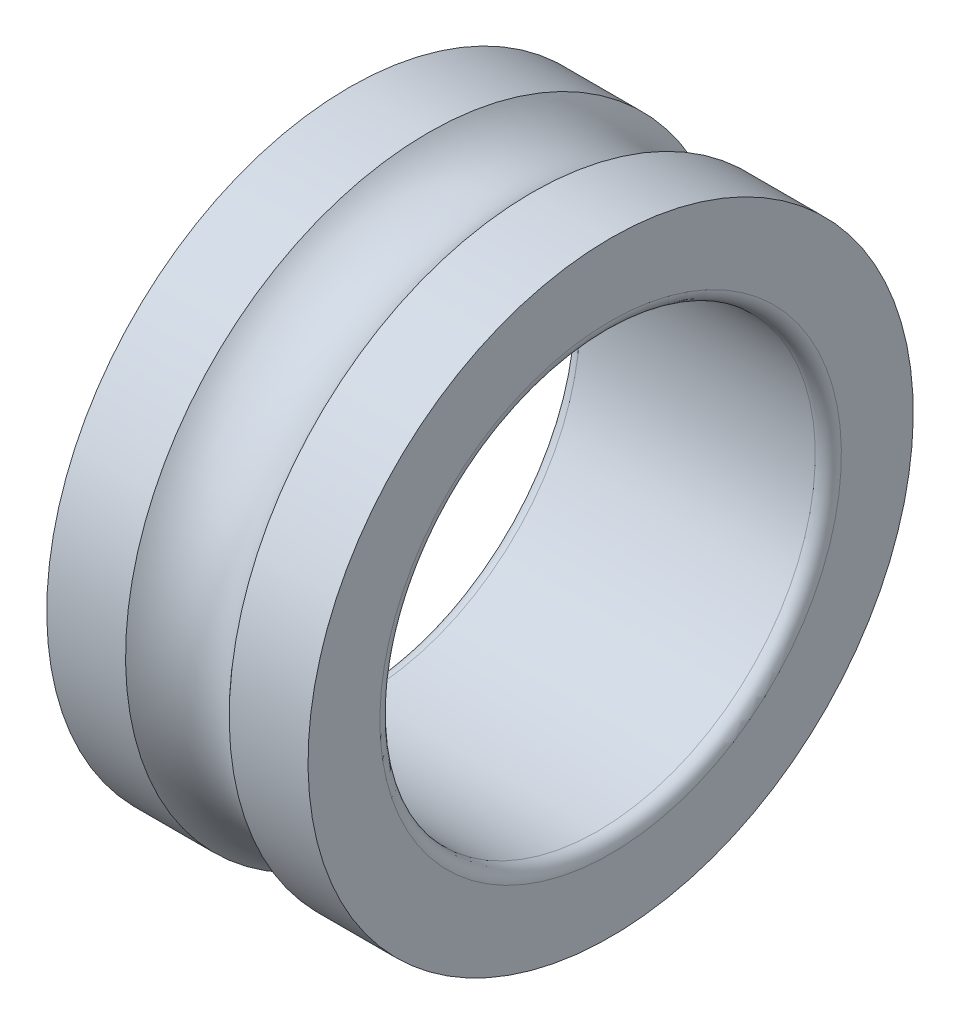
ISO-10303-21;
HEADER;
FILE_DESCRIPTION(('STEP AP214'),'2;1');
FILE_NAME('part.step','',(''),(''),'','','');
FILE_SCHEMA(('AUTOMOTIVE_DESIGN { 1 0 10303 214 1 1 1 1 }'));
ENDSEC;
DATA;
#1=APPLICATION_CONTEXT('core data for automotive mechanical design processes');
#2=APPLICATION_PROTOCOL_DEFINITION('international standard','automotive_design',2000,#1);
#3=PRODUCT_CONTEXT('',#1,'mechanical');
#4=PRODUCT('Part','Part','',(#3));
#5=PRODUCT_RELATED_PRODUCT_CATEGORY('part','',(#4));
#6=PRODUCT_DEFINITION_FORMATION('','',#4);
#7=PRODUCT_DEFINITION_CONTEXT('part definition',#1,'design');
#8=PRODUCT_DEFINITION('design','',#6,#7);
#9=PRODUCT_DEFINITION_SHAPE('','',#8);
#10=(LENGTH_UNIT() NAMED_UNIT(*) SI_UNIT(.MILLI.,.METRE.));
#11=(NAMED_UNIT(*) PLANE_ANGLE_UNIT() SI_UNIT($,.RADIAN.));
#12=(NAMED_UNIT(*) SI_UNIT($,.STERADIAN.) SOLID_ANGLE_UNIT());
#13=UNCERTAINTY_MEASURE_WITH_UNIT(LENGTH_MEASURE(1.E-05),#10,'distance_accuracy_value','');
#14=(GEOMETRIC_REPRESENTATION_CONTEXT(3) GLOBAL_UNCERTAINTY_ASSIGNED_CONTEXT((#13)) GLOBAL_UNIT_ASSIGNED_CONTEXT((#10,
#11,#12)) REPRESENTATION_CONTEXT('',''));
#15=CARTESIAN_POINT('',(0.,0.,0.));
#16=DIRECTION('',(0.,0.,1.));
#17=DIRECTION('',(1.,0.,0.));
#18=AXIS2_PLACEMENT_3D('',#15,#16,#17);
#19=CARTESIAN_POINT('',(5.0953268535015,0.,0.));
#20=DIRECTION('',(-1.,0.,0.));
#21=DIRECTION('',(0.,1.,0.));
#22=AXIS2_PLACEMENT_3D('',#19,#20,#21);
#23=CYLINDRICAL_SURFACE('',#22,6.95);
#24=CARTESIAN_POINT('',(4.190653707003,0.,0.));
#25=DIRECTION('',(1.,0.,0.));
#26=DIRECTION('',(0.,1.,0.));
#27=AXIS2_PLACEMENT_3D('',#24,#25,#26);
#28=CIRCLE('',#27,6.95);
#29=CARTESIAN_POINT('',(4.190653707003,6.95,0.));
#30=VERTEX_POINT('',#29);
#31=EDGE_CURVE('E11',#30,#30,#28,.T.);
#32=ORIENTED_EDGE('',*,*,#31,.T.);
#33=EDGE_LOOP('',(#32));
#34=FACE_BOUND('',#33,.T.);
#35=CARTESIAN_POINT('',(6.,0.,0.));
#36=DIRECTION('',(1.,0.,0.));
#37=DIRECTION('',(0.,1.,0.));
#38=AXIS2_PLACEMENT_3D('',#35,#36,#37);
#39=CIRCLE('',#38,6.95);
#40=CARTESIAN_POINT('',(6.,6.95,0.));
#41=VERTEX_POINT('',#40);
#42=EDGE_CURVE('E46',#41,#41,#39,.T.);
#43=ORIENTED_EDGE('',*,*,#42,.F.);
#44=EDGE_LOOP('',(#43));
#45=FACE_BOUND('',#44,.T.);
#46=ADVANCED_FACE('F16',(#34,#45),#23,.T.);
#47=CARTESIAN_POINT('',(3.,0.,0.));
#48=DIRECTION('',(1.,0.,0.));
#49=DIRECTION('',(0.,0.,-1.));
#50=AXIS2_PLACEMENT_3D('',#47,#48,#49);
#51=TOROIDAL_SURFACE('',#50,8.,1.5875);
#52=CARTESIAN_POINT('',(1.809346292997,0.,0.));
#53=DIRECTION('',(1.,0.,0.));
#54=DIRECTION('',(0.,1.,0.));
#55=AXIS2_PLACEMENT_3D('',#52,#53,#54);
#56=CIRCLE('',#55,6.95);
#57=CARTESIAN_POINT('',(1.809346292997,6.95,0.));
#58=VERTEX_POINT('',#57);
#59=EDGE_CURVE('E26',#58,#58,#56,.T.);
#60=ORIENTED_EDGE('',*,*,#59,.T.);
#61=EDGE_LOOP('',(#60));
#62=FACE_BOUND('',#61,.T.);
#63=ORIENTED_EDGE('',*,*,#31,.F.);
#64=EDGE_LOOP('',(#63));
#65=FACE_BOUND('',#64,.T.);
#66=ADVANCED_FACE('F90',(#62,#65),#51,.F.);
#67=CARTESIAN_POINT('',(0.904673146498497,0.,0.));
#68=DIRECTION('',(-1.,0.,0.));
#69=DIRECTION('',(0.,1.,0.));
#70=AXIS2_PLACEMENT_3D('',#67,#68,#69);
#71=CYLINDRICAL_SURFACE('',#70,6.95);
#72=CARTESIAN_POINT('',(0.,0.,0.));
#73=DIRECTION('',(1.,0.,0.));
#74=DIRECTION('',(0.,1.,0.));
#75=AXIS2_PLACEMENT_3D('',#72,#73,#74);
#76=CIRCLE('',#75,6.95);
#77=CARTESIAN_POINT('',(0.,6.95,0.));
#78=VERTEX_POINT('',#77);
#79=EDGE_CURVE('E62',#78,#78,#76,.T.);
#80=ORIENTED_EDGE('',*,*,#79,.T.);
#81=EDGE_LOOP('',(#80));
#82=FACE_BOUND('',#81,.T.);
#83=ORIENTED_EDGE('',*,*,#59,.F.);
#84=EDGE_LOOP('',(#83));
#85=FACE_BOUND('',#84,.T.);
#86=ADVANCED_FACE('F63',(#82,#85),#71,.T.);
#87=CARTESIAN_POINT('',(0.,6.125,0.));
#88=DIRECTION('',(-1.,0.,0.));
#89=DIRECTION('',(0.,-1.,0.));
#90=AXIS2_PLACEMENT_3D('',#87,#88,#89);
#91=PLANE('',#90);
#92=CARTESIAN_POINT('',(0.,0.,0.));
#93=DIRECTION('',(1.,0.,0.));
#94=DIRECTION('',(0.,1.,0.));
#95=AXIS2_PLACEMENT_3D('',#92,#93,#94);
#96=CIRCLE('',#95,5.3);
#97=CARTESIAN_POINT('',(0.,5.3,0.));
#98=VERTEX_POINT('',#97);
#99=EDGE_CURVE('E20',#98,#98,#96,.T.);
#100=ORIENTED_EDGE('',*,*,#99,.T.);
#101=EDGE_LOOP('',(#100));
#102=FACE_BOUND('',#101,.T.);
#103=ORIENTED_EDGE('',*,*,#79,.F.);
#104=EDGE_LOOP('',(#103));
#105=FACE_BOUND('',#104,.T.);
#106=ADVANCED_FACE('F18',(#102,#105),#91,.T.);
#107=CARTESIAN_POINT('',(0.3,0.,0.));
#108=DIRECTION('',(1.,0.,0.));
#109=DIRECTION('',(0.,0.,-1.));
#110=AXIS2_PLACEMENT_3D('',#107,#108,#109);
#111=TOROIDAL_SURFACE('',#110,5.3,0.3);
#112=CARTESIAN_POINT('',(0.3,0.,0.));
#113=DIRECTION('',(1.,0.,0.));
#114=DIRECTION('',(0.,1.,0.));
#115=AXIS2_PLACEMENT_3D('',#112,#113,#114);
#116=CIRCLE('',#115,5.);
#117=CARTESIAN_POINT('',(0.3,5.,0.));
#118=VERTEX_POINT('',#117);
#119=EDGE_CURVE('E68',#118,#118,#116,.T.);
#120=ORIENTED_EDGE('',*,*,#119,.T.);
#121=EDGE_LOOP('',(#120));
#122=FACE_BOUND('',#121,.T.);
#123=ORIENTED_EDGE('',*,*,#99,.F.);
#124=EDGE_LOOP('',(#123));
#125=FACE_BOUND('',#124,.T.);
#126=ADVANCED_FACE('F74',(#122,#125),#111,.T.);
#127=CARTESIAN_POINT('',(3.,0.,0.));
#128=DIRECTION('',(-1.,0.,0.));
#129=DIRECTION('',(0.,1.,0.));
#130=AXIS2_PLACEMENT_3D('',#127,#128,#129);
#131=CYLINDRICAL_SURFACE('',#130,5.);
#132=CARTESIAN_POINT('',(5.7,0.,0.));
#133=DIRECTION('',(1.,0.,0.));
#134=DIRECTION('',(0.,1.,0.));
#135=AXIS2_PLACEMENT_3D('',#132,#133,#134);
#136=CIRCLE('',#135,5.);
#137=CARTESIAN_POINT('',(5.7,5.,0.));
#138=VERTEX_POINT('',#137);
#139=EDGE_CURVE('E52',#138,#138,#136,.T.);
#140=ORIENTED_EDGE('',*,*,#139,.T.);
#141=EDGE_LOOP('',(#140));
#142=FACE_BOUND('',#141,.T.);
#143=ORIENTED_EDGE('',*,*,#119,.F.);
#144=EDGE_LOOP('',(#143));
#145=FACE_BOUND('',#144,.T.);
#146=ADVANCED_FACE('F77',(#142,#145),#131,.F.);
#147=CARTESIAN_POINT('',(5.7,0.,0.));
#148=DIRECTION('',(1.,0.,0.));
#149=DIRECTION('',(0.,0.,-1.));
#150=AXIS2_PLACEMENT_3D('',#147,#148,#149);
#151=TOROIDAL_SURFACE('',#150,5.3,0.3);
#152=CARTESIAN_POINT('',(6.,0.,0.));
#153=DIRECTION('',(1.,0.,0.));
#154=DIRECTION('',(0.,1.,0.));
#155=AXIS2_PLACEMENT_3D('',#152,#153,#154);
#156=CIRCLE('',#155,5.3);
#157=CARTESIAN_POINT('',(6.,5.3,0.));
#158=VERTEX_POINT('',#157);
#159=EDGE_CURVE('E41',#158,#158,#156,.T.);
#160=ORIENTED_EDGE('',*,*,#159,.T.);
#161=EDGE_LOOP('',(#160));
#162=FACE_BOUND('',#161,.T.);
#163=ORIENTED_EDGE('',*,*,#139,.F.);
#164=EDGE_LOOP('',(#163));
#165=FACE_BOUND('',#164,.T.);
#166=ADVANCED_FACE('F79',(#162,#165),#151,.T.);
#167=CARTESIAN_POINT('',(6.,6.125,0.));
#168=DIRECTION('',(1.,0.,0.));
#169=DIRECTION('',(0.,1.,0.));
#170=AXIS2_PLACEMENT_3D('',#167,#168,#169);
#171=PLANE('',#170);
#172=ORIENTED_EDGE('',*,*,#42,.T.);
#173=EDGE_LOOP('',(#172));
#174=FACE_BOUND('',#173,.T.);
#175=ORIENTED_EDGE('',*,*,#159,.F.);
#176=EDGE_LOOP('',(#175));
#177=FACE_BOUND('',#176,.T.);
#178=ADVANCED_FACE('F86',(#174,#177),#171,.T.);
#179=CLOSED_SHELL('',(#46,#66,#86,#106,#126,#146,#166,#178));
#180=MANIFOLD_SOLID_BREP('B1',#179);
#181=ADVANCED_BREP_SHAPE_REPRESENTATION('',(#18,#180),#14);
#182=SHAPE_DEFINITION_REPRESENTATION(#9,#181);
ENDSEC;
END-ISO-10303-21;
